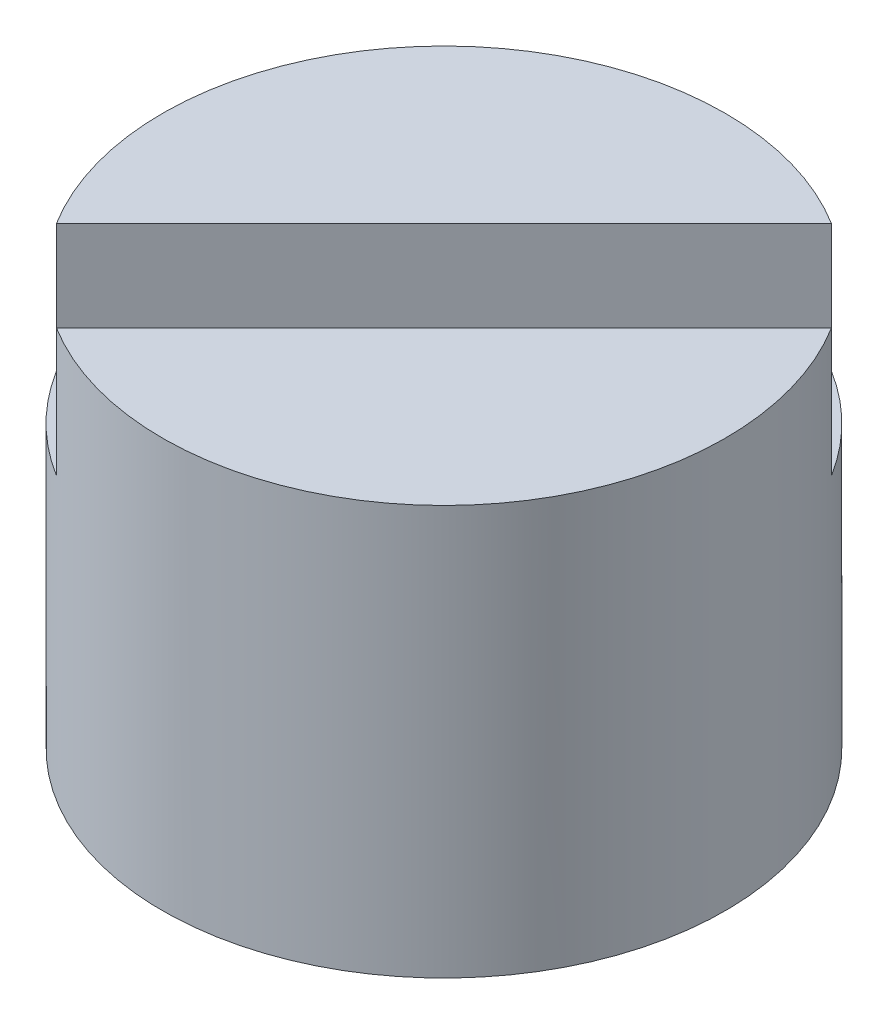
ISO-10303-21;
HEADER;
FILE_DESCRIPTION(('STEP AP214'),'2;1');
FILE_NAME('part.step','',(''),(''),'','','');
FILE_SCHEMA(('AUTOMOTIVE_DESIGN { 1 0 10303 214 1 1 1 1 }'));
ENDSEC;
DATA;
#1=APPLICATION_CONTEXT('core data for automotive mechanical design processes');
#2=APPLICATION_PROTOCOL_DEFINITION('international standard','automotive_design',2000,#1);
#3=PRODUCT_CONTEXT('',#1,'mechanical');
#4=PRODUCT('Part','Part','',(#3));
#5=PRODUCT_RELATED_PRODUCT_CATEGORY('part','',(#4));
#6=PRODUCT_DEFINITION_FORMATION('','',#4);
#7=PRODUCT_DEFINITION_CONTEXT('part definition',#1,'design');
#8=PRODUCT_DEFINITION('design','',#6,#7);
#9=PRODUCT_DEFINITION_SHAPE('','',#8);
#10=(LENGTH_UNIT() NAMED_UNIT(*) SI_UNIT(.MILLI.,.METRE.));
#11=(NAMED_UNIT(*) PLANE_ANGLE_UNIT() SI_UNIT($,.RADIAN.));
#12=(NAMED_UNIT(*) SI_UNIT($,.STERADIAN.) SOLID_ANGLE_UNIT());
#13=UNCERTAINTY_MEASURE_WITH_UNIT(LENGTH_MEASURE(1.E-05),#10,'distance_accuracy_value','');
#14=(GEOMETRIC_REPRESENTATION_CONTEXT(3) GLOBAL_UNCERTAINTY_ASSIGNED_CONTEXT((#13)) GLOBAL_UNIT_ASSIGNED_CONTEXT((#10,
#11,#12)) REPRESENTATION_CONTEXT('',''));
#15=CARTESIAN_POINT('',(0.,0.,0.));
#16=DIRECTION('',(0.,0.,1.));
#17=DIRECTION('',(1.,0.,0.));
#18=AXIS2_PLACEMENT_3D('',#15,#16,#17);
#19=CARTESIAN_POINT('',(0.165760434326,11.1,2.480686175081));
#20=DIRECTION('',(-0.707106781186548,0.,-0.707106781186548));
#21=DIRECTION('',(-0.707106781186548,0.,0.707106781186548));
#22=AXIS2_PLACEMENT_3D('',#19,#20,#21);
#23=PLANE('',#22);
#24=DIRECTION('',(0.,1.,0.));
#25=VECTOR('',#24,1.);
#26=CARTESIAN_POINT('',(0.165760434326,11.1,2.480686175081));
#27=LINE('',#26,#25);
#28=CARTESIAN_POINT('',(0.165760434326156,11.1,2.48068617508084));
#29=VERTEX_POINT('',#28);
#30=CARTESIAN_POINT('',(0.165760434326156,11.6,2.48068617508084));
#31=VERTEX_POINT('',#30);
#32=EDGE_CURVE('E55',#29,#31,#27,.T.);
#33=ORIENTED_EDGE('',*,*,#32,.F.);
#34=DIRECTION('',(-0.707106781186548,0.,0.707106781186547));
#35=VECTOR('',#34,1.);
#36=CARTESIAN_POINT('',(1.680686175081,11.1,0.965760434326));
#37=LINE('',#36,#35);
#38=CARTESIAN_POINT('',(1.68068617508084,11.1,0.965760434326156));
#39=VERTEX_POINT('',#38);
#40=EDGE_CURVE('E67',#39,#29,#37,.T.);
#41=ORIENTED_EDGE('',*,*,#40,.F.);
#42=DIRECTION('',(0.,1.,0.));
#43=VECTOR('',#42,1.);
#44=CARTESIAN_POINT('',(1.680686175081,11.1,0.965760434326));
#45=LINE('',#44,#43);
#46=CARTESIAN_POINT('',(1.68068617508084,11.6,0.965760434326156));
#47=VERTEX_POINT('',#46);
#48=EDGE_CURVE('E72',#47,#39,#45,.F.);
#49=ORIENTED_EDGE('',*,*,#48,.F.);
#50=DIRECTION('',(0.707106781186548,0.,-0.707106781186547));
#51=VECTOR('',#50,1.);
#52=CARTESIAN_POINT('',(0.165760434326,11.6,2.480686175081));
#53=LINE('',#52,#51);
#54=EDGE_CURVE('E70',#31,#47,#53,.T.);
#55=ORIENTED_EDGE('',*,*,#54,.F.);
#56=EDGE_LOOP('',(#33,#41,#49,#55));
#57=FACE_BOUND('',#56,.T.);
#58=ADVANCED_FACE('F16',(#57),#23,.F.);
#59=CARTESIAN_POINT('',(1.1,11.1,1.9));
#60=DIRECTION('',(0.,1.,0.));
#61=DIRECTION('',(0.,0.,1.));
#62=AXIS2_PLACEMENT_3D('',#59,#60,#61);
#63=PLANE('',#62);
#64=CARTESIAN_POINT('',(1.1,11.1,1.9));
#65=DIRECTION('',(0.,-1.,0.));
#66=DIRECTION('',(0.,0.,-1.));
#67=AXIS2_PLACEMENT_3D('',#64,#65,#66);
#68=CIRCLE('',#67,1.1);
#69=CARTESIAN_POINT('',(2.03423956567384,11.1,1.31931382491916));
#70=VERTEX_POINT('',#69);
#71=EDGE_CURVE('E63',#70,#39,#68,.F.);
#72=ORIENTED_EDGE('',*,*,#71,.T.);
#73=ORIENTED_EDGE('',*,*,#40,.T.);
#74=CARTESIAN_POINT('',(1.1,11.1,1.9));
#75=DIRECTION('',(0.,-1.,0.));
#76=DIRECTION('',(0.,0.,-1.));
#77=AXIS2_PLACEMENT_3D('',#74,#75,#76);
#78=CIRCLE('',#77,1.1);
#79=CARTESIAN_POINT('',(0.51931382491927,11.1,2.83423956567366));
#80=VERTEX_POINT('',#79);
#81=EDGE_CURVE('E19',#29,#80,#78,.F.);
#82=ORIENTED_EDGE('',*,*,#81,.T.);
#83=DIRECTION('',(0.707106781186548,0.,-0.707106781186548));
#84=VECTOR('',#83,1.);
#85=CARTESIAN_POINT('',(2.034239565674,11.1,1.319313824919));
#86=LINE('',#85,#84);
#87=EDGE_CURVE('E76',#80,#70,#86,.T.);
#88=ORIENTED_EDGE('',*,*,#87,.T.);
#89=EDGE_LOOP('',(#72,#73,#82,#88));
#90=FACE_BOUND('',#89,.T.);
#91=ADVANCED_FACE('F74',(#90),#63,.T.);
#92=CARTESIAN_POINT('',(1.1,11.6,1.9));
#93=DIRECTION('',(0.,1.,0.));
#94=DIRECTION('',(0.,0.,1.));
#95=AXIS2_PLACEMENT_3D('',#92,#93,#94);
#96=PLANE('',#95);
#97=ORIENTED_EDGE('',*,*,#54,.T.);
#98=CARTESIAN_POINT('',(1.1,11.6,1.9));
#99=DIRECTION('',(0.,-1.,0.));
#100=DIRECTION('',(0.,0.,-1.));
#101=AXIS2_PLACEMENT_3D('',#98,#99,#100);
#102=CIRCLE('',#101,1.1);
#103=EDGE_CURVE('E83',#31,#47,#102,.T.);
#104=ORIENTED_EDGE('',*,*,#103,.F.);
#105=EDGE_LOOP('',(#97,#104));
#106=FACE_BOUND('',#105,.T.);
#107=ADVANCED_FACE('F103',(#106),#96,.T.);
#108=CARTESIAN_POINT('',(2.034239565674,11.1,1.319313824919));
#109=DIRECTION('',(0.707106781186548,0.,0.707106781186548));
#110=DIRECTION('',(0.707106781186548,0.,-0.707106781186548));
#111=AXIS2_PLACEMENT_3D('',#108,#109,#110);
#112=PLANE('',#111);
#113=DIRECTION('',(0.,1.,0.));
#114=VECTOR('',#113,1.);
#115=CARTESIAN_POINT('',(2.034239565674,11.1,1.319313824919));
#116=LINE('',#115,#114);
#117=CARTESIAN_POINT('',(2.03423956567384,11.6,1.31931382491916));
#118=VERTEX_POINT('',#117);
#119=EDGE_CURVE('E34',#70,#118,#116,.T.);
#120=ORIENTED_EDGE('',*,*,#119,.F.);
#121=ORIENTED_EDGE('',*,*,#87,.F.);
#122=DIRECTION('',(0.,-1.,0.));
#123=VECTOR('',#122,1.);
#124=CARTESIAN_POINT('',(0.519313824919227,11.6,2.83423956567364));
#125=LINE('',#124,#123);
#126=CARTESIAN_POINT('',(0.51931382491927,11.6,2.83423956567366));
#127=VERTEX_POINT('',#126);
#128=EDGE_CURVE('E58',#127,#80,#125,.T.);
#129=ORIENTED_EDGE('',*,*,#128,.F.);
#130=DIRECTION('',(-0.707106781186547,0.,0.707106781186547));
#131=VECTOR('',#130,1.);
#132=CARTESIAN_POINT('',(2.034239565674,11.6,1.319313824919));
#133=LINE('',#132,#131);
#134=EDGE_CURVE('E82',#118,#127,#133,.T.);
#135=ORIENTED_EDGE('',*,*,#134,.F.);
#136=EDGE_LOOP('',(#120,#121,#129,#135));
#137=FACE_BOUND('',#136,.T.);
#138=ADVANCED_FACE('F89',(#137),#112,.F.);
#139=CARTESIAN_POINT('',(1.1,11.6,1.9));
#140=DIRECTION('',(0.,1.,0.));
#141=DIRECTION('',(0.,0.,1.));
#142=AXIS2_PLACEMENT_3D('',#139,#140,#141);
#143=PLANE('',#142);
#144=ORIENTED_EDGE('',*,*,#134,.T.);
#145=CARTESIAN_POINT('',(1.1,11.6,1.9));
#146=DIRECTION('',(0.,-1.,0.));
#147=DIRECTION('',(0.,0.,-1.));
#148=AXIS2_PLACEMENT_3D('',#145,#146,#147);
#149=CIRCLE('',#148,1.1);
#150=EDGE_CURVE('E25',#118,#127,#149,.T.);
#151=ORIENTED_EDGE('',*,*,#150,.F.);
#152=EDGE_LOOP('',(#144,#151));
#153=FACE_BOUND('',#152,.T.);
#154=ADVANCED_FACE('F92',(#153),#143,.T.);
#155=CARTESIAN_POINT('',(1.1,10.,1.9));
#156=DIRECTION('',(0.,1.,0.));
#157=DIRECTION('',(0.,0.,1.));
#158=AXIS2_PLACEMENT_3D('',#155,#156,#157);
#159=PLANE('',#158);
#160=CARTESIAN_POINT('',(1.1,10.,1.9));
#161=DIRECTION('',(0.,-1.,0.));
#162=DIRECTION('',(0.,0.,-1.));
#163=AXIS2_PLACEMENT_3D('',#160,#161,#162);
#164=CIRCLE('',#163,1.1);
#165=CARTESIAN_POINT('',(1.1,10.,0.8));
#166=VERTEX_POINT('',#165);
#167=EDGE_CURVE('E11',#166,#166,#164,.F.);
#168=ORIENTED_EDGE('',*,*,#167,.F.);
#169=EDGE_LOOP('',(#168));
#170=FACE_BOUND('',#169,.T.);
#171=ADVANCED_FACE('F94',(#170),#159,.F.);
#172=CARTESIAN_POINT('',(1.1,11.6,1.9));
#173=DIRECTION('',(0.,-1.,0.));
#174=DIRECTION('',(0.,0.,-1.));
#175=AXIS2_PLACEMENT_3D('',#172,#173,#174);
#176=CYLINDRICAL_SURFACE('',#175,1.1);
#177=ORIENTED_EDGE('',*,*,#150,.T.);
#178=ORIENTED_EDGE('',*,*,#128,.T.);
#179=ORIENTED_EDGE('',*,*,#81,.F.);
#180=ORIENTED_EDGE('',*,*,#32,.T.);
#181=ORIENTED_EDGE('',*,*,#103,.T.);
#182=ORIENTED_EDGE('',*,*,#48,.T.);
#183=ORIENTED_EDGE('',*,*,#71,.F.);
#184=ORIENTED_EDGE('',*,*,#119,.T.);
#185=EDGE_LOOP('',(#177,#178,#179,#180,#181,#182,#183,#184));
#186=FACE_BOUND('',#185,.T.);
#187=ORIENTED_EDGE('',*,*,#167,.T.);
#188=EDGE_LOOP('',(#187));
#189=FACE_BOUND('',#188,.T.);
#190=ADVANCED_FACE('F53',(#186,#189),#176,.T.);
#191=CLOSED_SHELL('',(#58,#91,#107,#138,#154,#171,#190));
#192=MANIFOLD_SOLID_BREP('B1',#191);
#193=ADVANCED_BREP_SHAPE_REPRESENTATION('',(#18,#192),#14);
#194=SHAPE_DEFINITION_REPRESENTATION(#9,#193);
ENDSEC;
END-ISO-10303-21;
